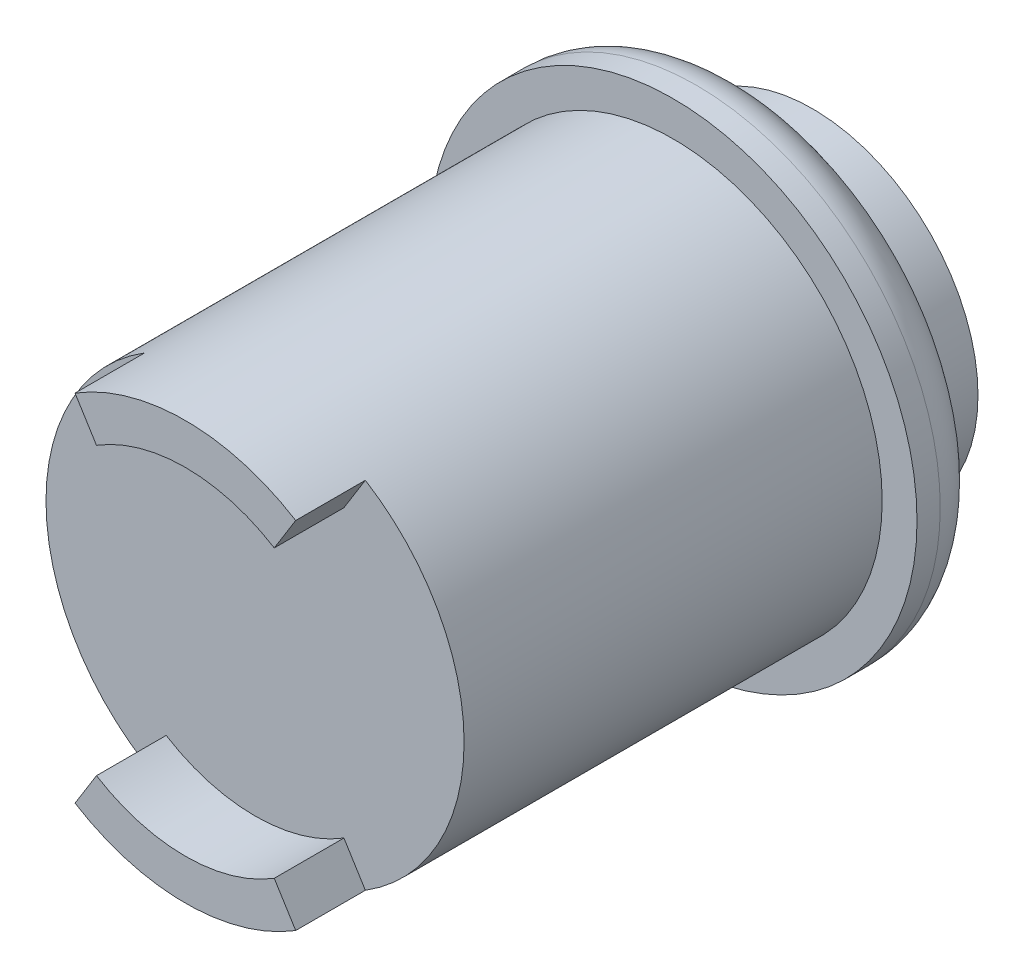
ISO-10303-21;
HEADER;
FILE_DESCRIPTION(('STEP AP214'),'2;1');
FILE_NAME('part.step','',(''),(''),'','','');
FILE_SCHEMA(('AUTOMOTIVE_DESIGN { 1 0 10303 214 1 1 1 1 }'));
ENDSEC;
DATA;
#1=APPLICATION_CONTEXT('core data for automotive mechanical design processes');
#2=APPLICATION_PROTOCOL_DEFINITION('international standard','automotive_design',2000,#1);
#3=PRODUCT_CONTEXT('',#1,'mechanical');
#4=PRODUCT('Part','Part','',(#3));
#5=PRODUCT_RELATED_PRODUCT_CATEGORY('part','',(#4));
#6=PRODUCT_DEFINITION_FORMATION('','',#4);
#7=PRODUCT_DEFINITION_CONTEXT('part definition',#1,'design');
#8=PRODUCT_DEFINITION('design','',#6,#7);
#9=PRODUCT_DEFINITION_SHAPE('','',#8);
#10=(LENGTH_UNIT() NAMED_UNIT(*) SI_UNIT(.MILLI.,.METRE.));
#11=(NAMED_UNIT(*) PLANE_ANGLE_UNIT() SI_UNIT($,.RADIAN.));
#12=(NAMED_UNIT(*) SI_UNIT($,.STERADIAN.) SOLID_ANGLE_UNIT());
#13=UNCERTAINTY_MEASURE_WITH_UNIT(LENGTH_MEASURE(1.E-05),#10,'distance_accuracy_value','');
#14=(GEOMETRIC_REPRESENTATION_CONTEXT(3) GLOBAL_UNCERTAINTY_ASSIGNED_CONTEXT((#13)) GLOBAL_UNIT_ASSIGNED_CONTEXT((#10,
#11,#12)) REPRESENTATION_CONTEXT('',''));
#15=CARTESIAN_POINT('',(0.,0.,0.));
#16=DIRECTION('',(0.,0.,1.));
#17=DIRECTION('',(1.,0.,0.));
#18=AXIS2_PLACEMENT_3D('',#15,#16,#17);
#19=CARTESIAN_POINT('',(0.,0.,33.3375));
#20=DIRECTION('',(0.,0.,1.));
#21=DIRECTION('',(1.,0.,0.));
#22=AXIS2_PLACEMENT_3D('',#19,#20,#21);
#23=PLANE('',#22);
#24=DIRECTION('',(-0.527777777777779,0.849382491745591,0.));
#25=VECTOR('',#24,1.);
#26=CARTESIAN_POINT('',(-7.540625,12.1355523508151,33.3375));
#27=LINE('',#26,#25);
#28=CARTESIAN_POINT('',(-6.07439236111111,9.77586161593443,33.3375));
#29=VERTEX_POINT('',#28);
#30=CARTESIAN_POINT('',(-7.540625,12.1355523508151,33.3375));
#31=VERTEX_POINT('',#30);
#32=EDGE_CURVE('E93',#29,#31,#27,.T.);
#33=ORIENTED_EDGE('',*,*,#32,.F.);
#34=CARTESIAN_POINT('',(0.,0.,33.3375));
#35=DIRECTION('',(0.,0.,1.));
#36=DIRECTION('',(1.,0.,0.));
#37=AXIS2_PLACEMENT_3D('',#34,#35,#36);
#38=CIRCLE('',#37,11.509375);
#39=CARTESIAN_POINT('',(6.07439236111111,9.77586161593443,33.3375));
#40=VERTEX_POINT('',#39);
#41=EDGE_CURVE('E152',#40,#29,#38,.T.);
#42=ORIENTED_EDGE('',*,*,#41,.F.);
#43=DIRECTION('',(-0.527777777777779,-0.849382491745591,0.));
#44=VECTOR('',#43,1.);
#45=CARTESIAN_POINT('',(7.540625,12.1355523508151,33.3375));
#46=LINE('',#45,#44);
#47=CARTESIAN_POINT('',(7.540625,12.1355523508151,33.3375));
#48=VERTEX_POINT('',#47);
#49=EDGE_CURVE('E120',#48,#40,#46,.T.);
#50=ORIENTED_EDGE('',*,*,#49,.F.);
#51=CARTESIAN_POINT('',(0.,0.,33.3375));
#52=DIRECTION('',(0.,0.,1.));
#53=DIRECTION('',(1.,0.,0.));
#54=AXIS2_PLACEMENT_3D('',#51,#52,#53);
#55=CIRCLE('',#54,14.2875);
#56=EDGE_CURVE('E177',#48,#31,#55,.T.);
#57=ORIENTED_EDGE('',*,*,#56,.T.);
#58=EDGE_LOOP('',(#33,#42,#50,#57));
#59=FACE_BOUND('',#58,.T.);
#60=ADVANCED_FACE('F42',(#59),#23,.T.);
#61=CARTESIAN_POINT('',(0.,0.,33.3375));
#62=DIRECTION('',(0.,0.,-1.));
#63=DIRECTION('',(-1.,0.,0.));
#64=AXIS2_PLACEMENT_3D('',#61,#62,#63);
#65=CYLINDRICAL_SURFACE('',#64,14.2875);
#66=CARTESIAN_POINT('',(0.,0.,28.575));
#67=DIRECTION('',(0.,0.,1.));
#68=DIRECTION('',(1.,0.,0.));
#69=AXIS2_PLACEMENT_3D('',#66,#67,#68);
#70=CIRCLE('',#69,14.2875);
#71=CARTESIAN_POINT('',(-7.540625,12.1355523508151,28.575));
#72=VERTEX_POINT('',#71);
#73=CARTESIAN_POINT('',(-7.540625,-12.1355523508151,28.575));
#74=VERTEX_POINT('',#73);
#75=EDGE_CURVE('E155',#72,#74,#70,.T.);
#76=ORIENTED_EDGE('',*,*,#75,.F.);
#77=DIRECTION('',(0.,0.,1.));
#78=VECTOR('',#77,1.);
#79=CARTESIAN_POINT('',(-7.540625,12.1355523508151,28.575));
#80=LINE('',#79,#78);
#81=EDGE_CURVE('E66',#72,#31,#80,.T.);
#82=ORIENTED_EDGE('',*,*,#81,.T.);
#83=ORIENTED_EDGE('',*,*,#56,.F.);
#84=DIRECTION('',(0.,0.,1.));
#85=VECTOR('',#84,1.);
#86=CARTESIAN_POINT('',(7.540625,12.1355523508151,28.575));
#87=LINE('',#86,#85);
#88=CARTESIAN_POINT('',(7.540625,12.1355523508151,28.575));
#89=VERTEX_POINT('',#88);
#90=EDGE_CURVE('E125',#89,#48,#87,.T.);
#91=ORIENTED_EDGE('',*,*,#90,.F.);
#92=CARTESIAN_POINT('',(0.,0.,28.575));
#93=DIRECTION('',(0.,0.,1.));
#94=DIRECTION('',(1.,0.,0.));
#95=AXIS2_PLACEMENT_3D('',#92,#93,#94);
#96=CIRCLE('',#95,14.2875);
#97=CARTESIAN_POINT('',(7.540625,-12.1355523508151,28.575));
#98=VERTEX_POINT('',#97);
#99=EDGE_CURVE('E136',#98,#89,#96,.T.);
#100=ORIENTED_EDGE('',*,*,#99,.F.);
#101=DIRECTION('',(0.,0.,1.));
#102=VECTOR('',#101,1.);
#103=CARTESIAN_POINT('',(7.540625,-12.1355523508151,28.575));
#104=LINE('',#103,#102);
#105=CARTESIAN_POINT('',(7.540625,-12.1355523508151,33.3375));
#106=VERTEX_POINT('',#105);
#107=EDGE_CURVE('E160',#98,#106,#104,.T.);
#108=ORIENTED_EDGE('',*,*,#107,.T.);
#109=CARTESIAN_POINT('',(-7.540625,-12.1355523508151,33.3375));
#110=VERTEX_POINT('',#109);
#111=EDGE_CURVE('E180',#110,#106,#55,.T.);
#112=ORIENTED_EDGE('',*,*,#111,.F.);
#113=DIRECTION('',(0.,0.,1.));
#114=VECTOR('',#113,1.);
#115=CARTESIAN_POINT('',(-7.540625,-12.1355523508151,28.575));
#116=LINE('',#115,#114);
#117=EDGE_CURVE('E57',#74,#110,#116,.T.);
#118=ORIENTED_EDGE('',*,*,#117,.F.);
#119=EDGE_LOOP('',(#76,#82,#83,#91,#100,#108,#112,#118));
#120=FACE_BOUND('',#119,.T.);
#121=CARTESIAN_POINT('',(0.,0.,0.));
#122=DIRECTION('',(0.,0.,1.));
#123=DIRECTION('',(1.,0.,0.));
#124=AXIS2_PLACEMENT_3D('',#121,#122,#123);
#125=CIRCLE('',#124,14.2875);
#126=CARTESIAN_POINT('',(14.2875,0.,0.));
#127=VERTEX_POINT('',#126);
#128=EDGE_CURVE('E176',#127,#127,#125,.T.);
#129=ORIENTED_EDGE('',*,*,#128,.T.);
#130=EDGE_LOOP('',(#129));
#131=FACE_BOUND('',#130,.T.);
#132=ADVANCED_FACE('F202',(#120,#131),#65,.T.);
#133=DIRECTION('',(0.527777777777779,-0.849382491745591,0.));
#134=VECTOR('',#133,1.);
#135=CARTESIAN_POINT('',(6.07439236111111,-9.77586161593442,33.3375));
#136=LINE('',#135,#134);
#137=CARTESIAN_POINT('',(6.07439236111111,-9.77586161593442,33.3375));
#138=VERTEX_POINT('',#137);
#139=EDGE_CURVE('E149',#138,#106,#136,.T.);
#140=ORIENTED_EDGE('',*,*,#139,.F.);
#141=CARTESIAN_POINT('',(0.,0.,33.3375));
#142=DIRECTION('',(0.,0.,1.));
#143=DIRECTION('',(1.,0.,0.));
#144=AXIS2_PLACEMENT_3D('',#141,#142,#143);
#145=CIRCLE('',#144,11.509375);
#146=CARTESIAN_POINT('',(-6.07439236111111,-9.77586161593442,33.3375));
#147=VERTEX_POINT('',#146);
#148=EDGE_CURVE('E146',#147,#138,#145,.T.);
#149=ORIENTED_EDGE('',*,*,#148,.F.);
#150=DIRECTION('',(0.527777777777779,0.849382491745591,0.));
#151=VECTOR('',#150,1.);
#152=CARTESIAN_POINT('',(-6.07439236111111,-9.77586161593442,33.3375));
#153=LINE('',#152,#151);
#154=EDGE_CURVE('E144',#110,#147,#153,.T.);
#155=ORIENTED_EDGE('',*,*,#154,.F.);
#156=ORIENTED_EDGE('',*,*,#111,.T.);
#157=EDGE_LOOP('',(#140,#149,#155,#156));
#158=FACE_BOUND('',#157,.T.);
#159=ADVANCED_FACE('F205',(#158),#23,.T.);
#160=CARTESIAN_POINT('',(0.,0.,-4.7625));
#161=DIRECTION('',(0.,0.,1.));
#162=DIRECTION('',(1.,0.,0.));
#163=AXIS2_PLACEMENT_3D('',#160,#161,#162);
#164=CYLINDRICAL_SURFACE('',#163,16.66875);
#165=CARTESIAN_POINT('',(0.,0.,-1.5875));
#166=DIRECTION('',(0.,0.,-1.));
#167=DIRECTION('',(-1.,0.,0.));
#168=AXIS2_PLACEMENT_3D('',#165,#166,#167);
#169=CIRCLE('',#168,16.66875);
#170=CARTESIAN_POINT('',(16.66875,0.,-1.5875));
#171=VERTEX_POINT('',#170);
#172=EDGE_CURVE('E12',#171,#171,#169,.F.);
#173=CARTESIAN_POINT('',(0.,0.,0.));
#174=DIRECTION('',(0.,0.,-1.));
#175=DIRECTION('',(-1.,0.,0.));
#176=AXIS2_PLACEMENT_3D('',#173,#174,#175);
#177=CIRCLE('',#176,16.66875);
#178=CARTESIAN_POINT('',(16.66875,0.,0.));
#179=VERTEX_POINT('',#178);
#180=EDGE_CURVE('E171',#179,#179,#177,.T.);
#181=CARTESIAN_POINT('',(16.66875,0.,-1.5875));
#182=CARTESIAN_POINT('',(16.66875,0.,-1.57096354166667));
#183=CARTESIAN_POINT('',(16.66875,0.,-1.55442708333333));
#184=CARTESIAN_POINT('',(16.66875,0.,-1.52135416666667));
#185=CARTESIAN_POINT('',(16.66875,0.,-1.50481770833333));
#186=CARTESIAN_POINT('',(16.66875,0.,-1.47174479166667));
#187=CARTESIAN_POINT('',(16.66875,0.,-1.45520833333333));
#188=CARTESIAN_POINT('',(16.66875,0.,-1.42213541666667));
#189=CARTESIAN_POINT('',(16.66875,0.,-1.40559895833333));
#190=CARTESIAN_POINT('',(16.66875,0.,-1.37252604166667));
#191=CARTESIAN_POINT('',(16.66875,0.,-1.35598958333333));
#192=CARTESIAN_POINT('',(16.66875,0.,-1.32291666666667));
#193=CARTESIAN_POINT('',(16.66875,0.,-1.30638020833333));
#194=CARTESIAN_POINT('',(16.66875,0.,-1.27330729166667));
#195=CARTESIAN_POINT('',(16.66875,0.,-1.25677083333333));
#196=CARTESIAN_POINT('',(16.66875,0.,-1.22369791666667));
#197=CARTESIAN_POINT('',(16.66875,0.,-1.20716145833333));
#198=CARTESIAN_POINT('',(16.66875,0.,-1.17408854166667));
#199=CARTESIAN_POINT('',(16.66875,0.,-1.15755208333333));
#200=CARTESIAN_POINT('',(16.66875,0.,-1.12447916666667));
#201=CARTESIAN_POINT('',(16.66875,0.,-1.10794270833333));
#202=CARTESIAN_POINT('',(16.66875,0.,-1.07486979166667));
#203=CARTESIAN_POINT('',(16.66875,0.,-1.05833333333333));
#204=CARTESIAN_POINT('',(16.66875,0.,-1.02526041666667));
#205=CARTESIAN_POINT('',(16.66875,0.,-1.00872395833333));
#206=CARTESIAN_POINT('',(16.66875,0.,-0.975651041666666));
#207=CARTESIAN_POINT('',(16.66875,0.,-0.959114583333333));
#208=CARTESIAN_POINT('',(16.66875,0.,-0.926041666666666));
#209=CARTESIAN_POINT('',(16.66875,0.,-0.909505208333333));
#210=CARTESIAN_POINT('',(16.66875,0.,-0.876432291666666));
#211=CARTESIAN_POINT('',(16.66875,0.,-0.859895833333333));
#212=CARTESIAN_POINT('',(16.66875,0.,-0.826822916666667));
#213=CARTESIAN_POINT('',(16.66875,0.,-0.810286458333333));
#214=CARTESIAN_POINT('',(16.66875,0.,-0.777213541666667));
#215=CARTESIAN_POINT('',(16.66875,0.,-0.760677083333334));
#216=CARTESIAN_POINT('',(16.66875,0.,-0.727604166666667));
#217=CARTESIAN_POINT('',(16.66875,0.,-0.711067708333333));
#218=CARTESIAN_POINT('',(16.66875,0.,-0.677994791666667));
#219=CARTESIAN_POINT('',(16.66875,0.,-0.661458333333333));
#220=CARTESIAN_POINT('',(16.66875,0.,-0.628385416666667));
#221=CARTESIAN_POINT('',(16.66875,0.,-0.611848958333334));
#222=CARTESIAN_POINT('',(16.66875,0.,-0.578776041666667));
#223=CARTESIAN_POINT('',(16.66875,0.,-0.562239583333333));
#224=CARTESIAN_POINT('',(16.66875,0.,-0.529166666666666));
#225=CARTESIAN_POINT('',(16.66875,0.,-0.512630208333333));
#226=CARTESIAN_POINT('',(16.66875,0.,-0.479557291666667));
#227=CARTESIAN_POINT('',(16.66875,0.,-0.463020833333333));
#228=CARTESIAN_POINT('',(16.66875,0.,-0.429947916666667));
#229=CARTESIAN_POINT('',(16.66875,0.,-0.413411458333333));
#230=CARTESIAN_POINT('',(16.66875,0.,-0.380338541666666));
#231=CARTESIAN_POINT('',(16.66875,0.,-0.363802083333333));
#232=CARTESIAN_POINT('',(16.66875,0.,-0.330729166666667));
#233=CARTESIAN_POINT('',(16.66875,0.,-0.314192708333333));
#234=CARTESIAN_POINT('',(16.66875,0.,-0.281119791666667));
#235=CARTESIAN_POINT('',(16.66875,0.,-0.264583333333333));
#236=CARTESIAN_POINT('',(16.66875,0.,-0.231510416666666));
#237=CARTESIAN_POINT('',(16.66875,0.,-0.214973958333333));
#238=CARTESIAN_POINT('',(16.66875,0.,-0.181901041666667));
#239=CARTESIAN_POINT('',(16.66875,0.,-0.165364583333333));
#240=CARTESIAN_POINT('',(16.66875,0.,-0.132291666666667));
#241=CARTESIAN_POINT('',(16.66875,0.,-0.115755208333333));
#242=CARTESIAN_POINT('',(16.66875,0.,-0.0826822916666662));
#243=CARTESIAN_POINT('',(16.66875,0.,-0.066145833333333));
#244=CARTESIAN_POINT('',(16.66875,0.,-0.0330729166666665));
#245=CARTESIAN_POINT('',(16.66875,0.,-0.0165364583333332));
#246=CARTESIAN_POINT('',(16.66875,0.,0.));
#247=B_SPLINE_CURVE_WITH_KNOTS('',3,(#181,#182,#183,#184,#185,#186,#187,#188,#189,#190,#191,
#192,#193,#194,#195,#196,#197,#198,#199,#200,#201,#202,#203,#204,#205,#206,#207,#208,#209,#210,
#211,#212,#213,#214,#215,#216,#217,#218,#219,#220,#221,#222,#223,#224,#225,#226,#227,#228,#229,
#230,#231,#232,#233,#234,#235,#236,#237,#238,#239,#240,#241,#242,#243,#244,#245,#246),
.UNSPECIFIED.,.F.,.F.,(4,2,2,2,2,2,2,2,2,2,2,2,2,2,2,2,2,2,2,2,2,2,2,2,2,2,2,2,2,2,2,2,4),(0.,
0.0496093750000002,0.0992187499999999,0.148828125,0.1984375,0.248046875,0.29765625,0.347265625,
0.396875,0.446484375,0.49609375,0.545703125,0.5953125,0.644921875,0.69453125,0.744140625,
0.79375,0.843359374999999,0.89296875,0.942578125,0.9921875,1.041796875,1.09140625,1.141015625,
1.190625,1.240234375,1.28984375,1.339453125,1.3890625,1.438671875,1.48828125,1.537890625,
1.5875),.UNSPECIFIED.);
#248=EDGE_CURVE('BSEAM212',#171,#179,#247,.T.);
#249=ORIENTED_EDGE('',*,*,#172,.T.);
#250=ORIENTED_EDGE('',*,*,#180,.T.);
#251=ORIENTED_EDGE('',*,*,#248,.T.);
#252=ORIENTED_EDGE('',*,*,#248,.F.);
#253=EDGE_LOOP('',(#249,#251,#250,#252));
#254=FACE_BOUND('',#253,.T.);
#255=ADVANCED_FACE('F212',(#254),#164,.T.);
#256=CARTESIAN_POINT('',(0.,0.,-4.7625));
#257=DIRECTION('',(0.,0.,-1.));
#258=DIRECTION('',(-1.,0.,0.));
#259=AXIS2_PLACEMENT_3D('',#256,#257,#258);
#260=PLANE('',#259);
#261=CARTESIAN_POINT('',(0.,0.,-4.7625));
#262=DIRECTION('',(0.,0.,-1.));
#263=DIRECTION('',(-1.,0.,0.));
#264=AXIS2_PLACEMENT_3D('',#261,#262,#263);
#265=CIRCLE('',#264,11.3109375);
#266=CARTESIAN_POINT('',(11.3109375,0.,-4.7625));
#267=VERTEX_POINT('',#266);
#268=EDGE_CURVE('E157',#267,#267,#265,.T.);
#269=ORIENTED_EDGE('',*,*,#268,.F.);
#270=EDGE_LOOP('',(#269));
#271=FACE_BOUND('',#270,.T.);
#272=CARTESIAN_POINT('',(0.,0.,-4.7625));
#273=DIRECTION('',(0.,0.,-1.));
#274=DIRECTION('',(-1.,0.,0.));
#275=AXIS2_PLACEMENT_3D('',#272,#273,#274);
#276=CIRCLE('',#275,13.49375);
#277=CARTESIAN_POINT('',(-13.49375,0.,-4.7625));
#278=VERTEX_POINT('',#277);
#279=EDGE_CURVE('E50',#278,#278,#276,.T.);
#280=ORIENTED_EDGE('',*,*,#279,.T.);
#281=EDGE_LOOP('',(#280));
#282=FACE_BOUND('',#281,.T.);
#283=ADVANCED_FACE('F185',(#271,#282),#260,.T.);
#284=CARTESIAN_POINT('',(0.,0.,0.));
#285=DIRECTION('',(0.,0.,-1.));
#286=DIRECTION('',(-1.,0.,0.));
#287=AXIS2_PLACEMENT_3D('',#284,#285,#286);
#288=PLANE('',#287);
#289=ORIENTED_EDGE('',*,*,#128,.F.);
#290=EDGE_LOOP('',(#289));
#291=FACE_BOUND('',#290,.T.);
#292=ORIENTED_EDGE('',*,*,#180,.F.);
#293=EDGE_LOOP('',(#292));
#294=FACE_BOUND('',#293,.T.);
#295=ADVANCED_FACE('F189',(#291,#294),#288,.F.);
#296=CARTESIAN_POINT('',(0.,0.,-1.5875));
#297=DIRECTION('',(0.,0.,-1.));
#298=DIRECTION('',(-1.,0.,0.));
#299=AXIS2_PLACEMENT_3D('',#296,#297,#298);
#300=TOROIDAL_SURFACE('',#299,13.49375,3.175);
#301=ORIENTED_EDGE('',*,*,#172,.F.);
#302=EDGE_LOOP('',(#301));
#303=FACE_BOUND('',#302,.T.);
#304=ORIENTED_EDGE('',*,*,#279,.F.);
#305=EDGE_LOOP('',(#304));
#306=FACE_BOUND('',#305,.T.);
#307=ADVANCED_FACE('F44',(#303,#306),#300,.T.);
#308=CARTESIAN_POINT('',(0.,0.,-9.525));
#309=DIRECTION('',(0.,0.,1.));
#310=DIRECTION('',(1.,0.,0.));
#311=AXIS2_PLACEMENT_3D('',#308,#309,#310);
#312=CYLINDRICAL_SURFACE('',#311,11.3109375);
#313=CARTESIAN_POINT('',(0.,0.,-9.525));
#314=DIRECTION('',(0.,0.,-1.));
#315=DIRECTION('',(-1.,0.,0.));
#316=AXIS2_PLACEMENT_3D('',#313,#314,#315);
#317=CIRCLE('',#316,11.3109375);
#318=CARTESIAN_POINT('',(11.3109375,0.,-9.525));
#319=VERTEX_POINT('',#318);
#320=EDGE_CURVE('E168',#319,#319,#317,.T.);
#321=CARTESIAN_POINT('',(11.3109375,0.,-9.525));
#322=CARTESIAN_POINT('',(11.3109375,0.,-9.475390625));
#323=CARTESIAN_POINT('',(11.3109375,0.,-9.42578125));
#324=CARTESIAN_POINT('',(11.3109375,0.,-9.3265625));
#325=CARTESIAN_POINT('',(11.3109375,0.,-9.276953125));
#326=CARTESIAN_POINT('',(11.3109375,0.,-9.177734375));
#327=CARTESIAN_POINT('',(11.3109375,0.,-9.128125));
#328=CARTESIAN_POINT('',(11.3109375,0.,-9.02890625));
#329=CARTESIAN_POINT('',(11.3109375,0.,-8.979296875));
#330=CARTESIAN_POINT('',(11.3109375,0.,-8.880078125));
#331=CARTESIAN_POINT('',(11.3109375,0.,-8.83046875));
#332=CARTESIAN_POINT('',(11.3109375,0.,-8.73125));
#333=CARTESIAN_POINT('',(11.3109375,0.,-8.681640625));
#334=CARTESIAN_POINT('',(11.3109375,0.,-8.582421875));
#335=CARTESIAN_POINT('',(11.3109375,0.,-8.5328125));
#336=CARTESIAN_POINT('',(11.3109375,0.,-8.43359375));
#337=CARTESIAN_POINT('',(11.3109375,0.,-8.383984375));
#338=CARTESIAN_POINT('',(11.3109375,0.,-8.284765625));
#339=CARTESIAN_POINT('',(11.3109375,0.,-8.23515625));
#340=CARTESIAN_POINT('',(11.3109375,0.,-8.1359375));
#341=CARTESIAN_POINT('',(11.3109375,0.,-8.086328125));
#342=CARTESIAN_POINT('',(11.3109375,0.,-7.987109375));
#343=CARTESIAN_POINT('',(11.3109375,0.,-7.9375));
#344=CARTESIAN_POINT('',(11.3109375,0.,-7.83828125));
#345=CARTESIAN_POINT('',(11.3109375,0.,-7.788671875));
#346=CARTESIAN_POINT('',(11.3109375,0.,-7.689453125));
#347=CARTESIAN_POINT('',(11.3109375,0.,-7.63984375));
#348=CARTESIAN_POINT('',(11.3109375,0.,-7.540625));
#349=CARTESIAN_POINT('',(11.3109375,0.,-7.491015625));
#350=CARTESIAN_POINT('',(11.3109375,0.,-7.391796875));
#351=CARTESIAN_POINT('',(11.3109375,0.,-7.3421875));
#352=CARTESIAN_POINT('',(11.3109375,0.,-7.24296875));
#353=CARTESIAN_POINT('',(11.3109375,0.,-7.193359375));
#354=CARTESIAN_POINT('',(11.3109375,0.,-7.094140625));
#355=CARTESIAN_POINT('',(11.3109375,0.,-7.04453125));
#356=CARTESIAN_POINT('',(11.3109375,0.,-6.9453125));
#357=CARTESIAN_POINT('',(11.3109375,0.,-6.895703125));
#358=CARTESIAN_POINT('',(11.3109375,0.,-6.796484375));
#359=CARTESIAN_POINT('',(11.3109375,0.,-6.746875));
#360=CARTESIAN_POINT('',(11.3109375,0.,-6.64765625));
#361=CARTESIAN_POINT('',(11.3109375,0.,-6.598046875));
#362=CARTESIAN_POINT('',(11.3109375,0.,-6.498828125));
#363=CARTESIAN_POINT('',(11.3109375,0.,-6.44921875));
#364=CARTESIAN_POINT('',(11.3109375,0.,-6.35));
#365=CARTESIAN_POINT('',(11.3109375,0.,-6.300390625));
#366=CARTESIAN_POINT('',(11.3109375,0.,-6.201171875));
#367=CARTESIAN_POINT('',(11.3109375,0.,-6.1515625));
#368=CARTESIAN_POINT('',(11.3109375,0.,-6.05234375));
#369=CARTESIAN_POINT('',(11.3109375,0.,-6.002734375));
#370=CARTESIAN_POINT('',(11.3109375,0.,-5.903515625));
#371=CARTESIAN_POINT('',(11.3109375,0.,-5.85390625));
#372=CARTESIAN_POINT('',(11.3109375,0.,-5.7546875));
#373=CARTESIAN_POINT('',(11.3109375,0.,-5.705078125));
#374=CARTESIAN_POINT('',(11.3109375,0.,-5.605859375));
#375=CARTESIAN_POINT('',(11.3109375,0.,-5.55625));
#376=CARTESIAN_POINT('',(11.3109375,0.,-5.45703125));
#377=CARTESIAN_POINT('',(11.3109375,0.,-5.407421875));
#378=CARTESIAN_POINT('',(11.3109375,0.,-5.308203125));
#379=CARTESIAN_POINT('',(11.3109375,0.,-5.25859375));
#380=CARTESIAN_POINT('',(11.3109375,0.,-5.159375));
#381=CARTESIAN_POINT('',(11.3109375,0.,-5.109765625));
#382=CARTESIAN_POINT('',(11.3109375,0.,-5.010546875));
#383=CARTESIAN_POINT('',(11.3109375,0.,-4.9609375));
#384=CARTESIAN_POINT('',(11.3109375,0.,-4.86171875));
#385=CARTESIAN_POINT('',(11.3109375,0.,-4.812109375));
#386=CARTESIAN_POINT('',(11.3109375,0.,-4.7625));
#387=B_SPLINE_CURVE_WITH_KNOTS('',3,(#321,#322,#323,#324,#325,#326,#327,#328,#329,#330,#331,
#332,#333,#334,#335,#336,#337,#338,#339,#340,#341,#342,#343,#344,#345,#346,#347,#348,#349,#350,
#351,#352,#353,#354,#355,#356,#357,#358,#359,#360,#361,#362,#363,#364,#365,#366,#367,#368,#369,
#370,#371,#372,#373,#374,#375,#376,#377,#378,#379,#380,#381,#382,#383,#384,#385,#386),
.UNSPECIFIED.,.F.,.F.,(4,2,2,2,2,2,2,2,2,2,2,2,2,2,2,2,2,2,2,2,2,2,2,2,2,2,2,2,2,2,2,2,4),(0.,
0.148828125,0.29765625,0.446484375,0.5953125,0.744140625,0.892968750000001,1.041796875,1.190625,
1.339453125,1.48828125,1.637109375,1.7859375,1.934765625,2.08359375,2.232421875,2.38125,
2.530078125,2.67890625,2.827734375,2.9765625,3.125390625,3.27421875,3.423046875,3.571875,
3.720703125,3.86953125,4.018359375,4.1671875,4.316015625,4.46484375,4.613671875,4.7625),.UNSPECIFIED.);
#388=EDGE_CURVE('BSEAM188',#319,#267,#387,.T.);
#389=ORIENTED_EDGE('',*,*,#320,.F.);
#390=ORIENTED_EDGE('',*,*,#268,.T.);
#391=ORIENTED_EDGE('',*,*,#388,.T.);
#392=ORIENTED_EDGE('',*,*,#388,.F.);
#393=EDGE_LOOP('',(#389,#391,#390,#392));
#394=FACE_BOUND('',#393,.T.);
#395=ADVANCED_FACE('F188',(#394),#312,.T.);
#396=CARTESIAN_POINT('',(0.,0.,-9.525));
#397=DIRECTION('',(0.,0.,-1.));
#398=DIRECTION('',(-1.,0.,0.));
#399=AXIS2_PLACEMENT_3D('',#396,#397,#398);
#400=PLANE('',#399);
#401=ORIENTED_EDGE('',*,*,#320,.T.);
#402=EDGE_LOOP('',(#401));
#403=FACE_BOUND('',#402,.T.);
#404=ADVANCED_FACE('F195',(#403),#400,.T.);
#405=CARTESIAN_POINT('',(-7.540625,12.1355523508151,28.575));
#406=DIRECTION('',(0.849382491745591,0.527777777777779,0.));
#407=DIRECTION('',(-0.527777777777779,0.849382491745591,0.));
#408=AXIS2_PLACEMENT_3D('',#405,#406,#407);
#409=PLANE('',#408);
#410=ORIENTED_EDGE('',*,*,#32,.T.);
#411=ORIENTED_EDGE('',*,*,#81,.F.);
#412=DIRECTION('',(-0.527777777777779,0.849382491745591,0.));
#413=VECTOR('',#412,1.);
#414=CARTESIAN_POINT('',(-7.540625,12.1355523508151,28.575));
#415=LINE('',#414,#413);
#416=CARTESIAN_POINT('',(-6.07439236111111,9.77586161593443,28.575));
#417=VERTEX_POINT('',#416);
#418=EDGE_CURVE('E131',#417,#72,#415,.T.);
#419=ORIENTED_EDGE('',*,*,#418,.F.);
#420=DIRECTION('',(0.,0.,1.));
#421=VECTOR('',#420,1.);
#422=CARTESIAN_POINT('',(-6.07439236111111,9.77586161593443,28.575));
#423=LINE('',#422,#421);
#424=EDGE_CURVE('E124',#417,#29,#423,.T.);
#425=ORIENTED_EDGE('',*,*,#424,.T.);
#426=EDGE_LOOP('',(#410,#411,#419,#425));
#427=FACE_BOUND('',#426,.T.);
#428=ADVANCED_FACE('F248',(#427),#409,.F.);
#429=CARTESIAN_POINT('',(0.,0.,28.575));
#430=DIRECTION('',(0.,0.,1.));
#431=DIRECTION('',(1.,0.,0.));
#432=AXIS2_PLACEMENT_3D('',#429,#430,#431);
#433=CYLINDRICAL_SURFACE('',#432,11.509375);
#434=ORIENTED_EDGE('',*,*,#41,.T.);
#435=ORIENTED_EDGE('',*,*,#424,.F.);
#436=CARTESIAN_POINT('',(0.,0.,28.575));
#437=DIRECTION('',(0.,0.,1.));
#438=DIRECTION('',(1.,0.,0.));
#439=AXIS2_PLACEMENT_3D('',#436,#437,#438);
#440=CIRCLE('',#439,11.509375);
#441=CARTESIAN_POINT('',(6.07439236111111,9.77586161593443,28.575));
#442=VERTEX_POINT('',#441);
#443=EDGE_CURVE('E128',#442,#417,#440,.T.);
#444=ORIENTED_EDGE('',*,*,#443,.F.);
#445=DIRECTION('',(0.,0.,1.));
#446=VECTOR('',#445,1.);
#447=CARTESIAN_POINT('',(6.07439236111111,9.77586161593443,28.575));
#448=LINE('',#447,#446);
#449=EDGE_CURVE('E113',#442,#40,#448,.T.);
#450=ORIENTED_EDGE('',*,*,#449,.T.);
#451=EDGE_LOOP('',(#434,#435,#444,#450));
#452=FACE_BOUND('',#451,.T.);
#453=ADVANCED_FACE('F129',(#452),#433,.F.);
#454=CARTESIAN_POINT('',(7.540625,12.1355523508151,28.575));
#455=DIRECTION('',(-0.849382491745591,0.527777777777779,0.));
#456=DIRECTION('',(-0.527777777777779,-0.849382491745591,0.));
#457=AXIS2_PLACEMENT_3D('',#454,#455,#456);
#458=PLANE('',#457);
#459=ORIENTED_EDGE('',*,*,#49,.T.);
#460=ORIENTED_EDGE('',*,*,#449,.F.);
#461=DIRECTION('',(-0.527777777777779,-0.849382491745591,0.));
#462=VECTOR('',#461,1.);
#463=CARTESIAN_POINT('',(7.540625,12.1355523508151,28.575));
#464=LINE('',#463,#462);
#465=EDGE_CURVE('E117',#89,#442,#464,.T.);
#466=ORIENTED_EDGE('',*,*,#465,.F.);
#467=ORIENTED_EDGE('',*,*,#90,.T.);
#468=EDGE_LOOP('',(#459,#460,#466,#467));
#469=FACE_BOUND('',#468,.T.);
#470=ADVANCED_FACE('F115',(#469),#458,.F.);
#471=CARTESIAN_POINT('',(6.07439236111111,-9.77586161593442,28.575));
#472=DIRECTION('',(-0.849382491745591,-0.527777777777779,0.));
#473=DIRECTION('',(0.527777777777779,-0.849382491745591,0.));
#474=AXIS2_PLACEMENT_3D('',#471,#472,#473);
#475=PLANE('',#474);
#476=ORIENTED_EDGE('',*,*,#139,.T.);
#477=ORIENTED_EDGE('',*,*,#107,.F.);
#478=DIRECTION('',(0.527777777777779,-0.849382491745591,0.));
#479=VECTOR('',#478,1.);
#480=CARTESIAN_POINT('',(6.07439236111111,-9.77586161593442,28.575));
#481=LINE('',#480,#479);
#482=CARTESIAN_POINT('',(6.07439236111111,-9.77586161593442,28.575));
#483=VERTEX_POINT('',#482);
#484=EDGE_CURVE('E139',#483,#98,#481,.T.);
#485=ORIENTED_EDGE('',*,*,#484,.F.);
#486=DIRECTION('',(0.,0.,1.));
#487=VECTOR('',#486,1.);
#488=CARTESIAN_POINT('',(6.07439236111111,-9.77586161593442,28.575));
#489=LINE('',#488,#487);
#490=EDGE_CURVE('E163',#483,#138,#489,.T.);
#491=ORIENTED_EDGE('',*,*,#490,.T.);
#492=EDGE_LOOP('',(#476,#477,#485,#491));
#493=FACE_BOUND('',#492,.T.);
#494=ADVANCED_FACE('F223',(#493),#475,.F.);
#495=CARTESIAN_POINT('',(0.,0.,28.575));
#496=DIRECTION('',(0.,0.,1.));
#497=DIRECTION('',(1.,0.,0.));
#498=AXIS2_PLACEMENT_3D('',#495,#496,#497);
#499=CYLINDRICAL_SURFACE('',#498,11.509375);
#500=ORIENTED_EDGE('',*,*,#148,.T.);
#501=ORIENTED_EDGE('',*,*,#490,.F.);
#502=CARTESIAN_POINT('',(0.,0.,28.575));
#503=DIRECTION('',(0.,0.,1.));
#504=DIRECTION('',(1.,0.,0.));
#505=AXIS2_PLACEMENT_3D('',#502,#503,#504);
#506=CIRCLE('',#505,11.509375);
#507=CARTESIAN_POINT('',(-6.07439236111111,-9.77586161593442,28.575));
#508=VERTEX_POINT('',#507);
#509=EDGE_CURVE('E229',#508,#483,#506,.T.);
#510=ORIENTED_EDGE('',*,*,#509,.F.);
#511=DIRECTION('',(0.,0.,1.));
#512=VECTOR('',#511,1.);
#513=CARTESIAN_POINT('',(-6.07439236111111,-9.77586161593442,28.575));
#514=LINE('',#513,#512);
#515=EDGE_CURVE('E165',#508,#147,#514,.T.);
#516=ORIENTED_EDGE('',*,*,#515,.T.);
#517=EDGE_LOOP('',(#500,#501,#510,#516));
#518=FACE_BOUND('',#517,.T.);
#519=ADVANCED_FACE('F235',(#518),#499,.F.);
#520=CARTESIAN_POINT('',(-6.07439236111111,-9.77586161593442,28.575));
#521=DIRECTION('',(0.849382491745591,-0.527777777777779,0.));
#522=DIRECTION('',(0.527777777777779,0.849382491745591,0.));
#523=AXIS2_PLACEMENT_3D('',#520,#521,#522);
#524=PLANE('',#523);
#525=ORIENTED_EDGE('',*,*,#154,.T.);
#526=ORIENTED_EDGE('',*,*,#515,.F.);
#527=DIRECTION('',(0.527777777777779,0.849382491745591,0.));
#528=VECTOR('',#527,1.);
#529=CARTESIAN_POINT('',(-6.07439236111111,-9.77586161593442,28.575));
#530=LINE('',#529,#528);
#531=EDGE_CURVE('E98',#74,#508,#530,.T.);
#532=ORIENTED_EDGE('',*,*,#531,.F.);
#533=ORIENTED_EDGE('',*,*,#117,.T.);
#534=EDGE_LOOP('',(#525,#526,#532,#533));
#535=FACE_BOUND('',#534,.T.);
#536=ADVANCED_FACE('F236',(#535),#524,.F.);
#537=CARTESIAN_POINT('',(0.,0.,28.575));
#538=DIRECTION('',(0.,0.,1.));
#539=DIRECTION('',(1.,0.,0.));
#540=AXIS2_PLACEMENT_3D('',#537,#538,#539);
#541=PLANE('',#540);
#542=ORIENTED_EDGE('',*,*,#75,.T.);
#543=ORIENTED_EDGE('',*,*,#531,.T.);
#544=ORIENTED_EDGE('',*,*,#509,.T.);
#545=ORIENTED_EDGE('',*,*,#484,.T.);
#546=ORIENTED_EDGE('',*,*,#99,.T.);
#547=ORIENTED_EDGE('',*,*,#465,.T.);
#548=ORIENTED_EDGE('',*,*,#443,.T.);
#549=ORIENTED_EDGE('',*,*,#418,.T.);
#550=EDGE_LOOP('',(#542,#543,#544,#545,#546,#547,#548,#549));
#551=FACE_BOUND('',#550,.T.);
#552=ADVANCED_FACE('F133',(#551),#541,.T.);
#553=CLOSED_SHELL('',(#60,#132,#159,#255,#283,#295,#307,#395,#404,#428,#453,#470,#494,#519,#536,#552));
#554=MANIFOLD_SOLID_BREP('B2',#553);
#555=ADVANCED_BREP_SHAPE_REPRESENTATION('',(#18,#554),#14);
#556=SHAPE_DEFINITION_REPRESENTATION(#9,#555);
ENDSEC;
END-ISO-10303-21;
